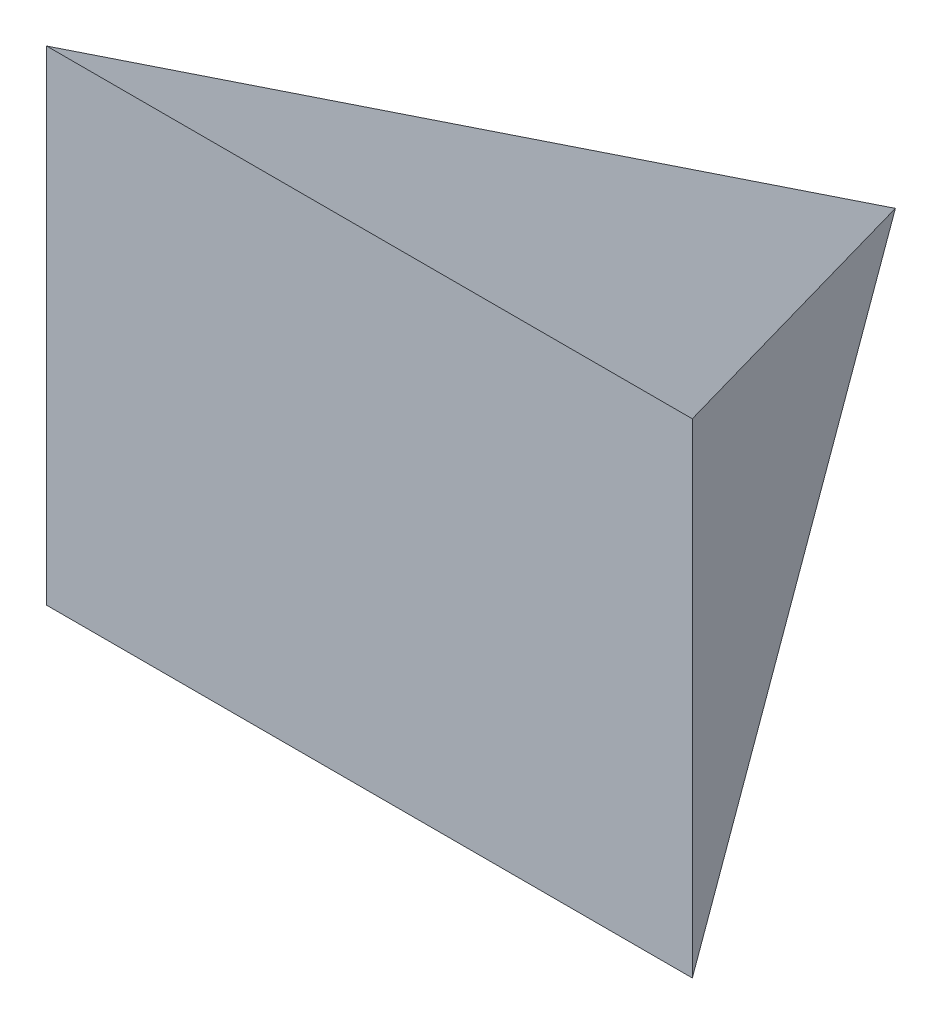
ISO-10303-21;
HEADER;
FILE_DESCRIPTION(('STEP AP214'),'2;1');
FILE_NAME('part.step','',(''),(''),'','','');
FILE_SCHEMA(('AUTOMOTIVE_DESIGN { 1 0 10303 214 1 1 1 1 }'));
ENDSEC;
DATA;
#1=APPLICATION_CONTEXT('core data for automotive mechanical design processes');
#2=APPLICATION_PROTOCOL_DEFINITION('international standard','automotive_design',2000,#1);
#3=PRODUCT_CONTEXT('',#1,'mechanical');
#4=PRODUCT('Part','Part','',(#3));
#5=PRODUCT_RELATED_PRODUCT_CATEGORY('part','',(#4));
#6=PRODUCT_DEFINITION_FORMATION('','',#4);
#7=PRODUCT_DEFINITION_CONTEXT('part definition',#1,'design');
#8=PRODUCT_DEFINITION('design','',#6,#7);
#9=PRODUCT_DEFINITION_SHAPE('','',#8);
#10=(LENGTH_UNIT() NAMED_UNIT(*) SI_UNIT(.MILLI.,.METRE.));
#11=(NAMED_UNIT(*) PLANE_ANGLE_UNIT() SI_UNIT($,.RADIAN.));
#12=(NAMED_UNIT(*) SI_UNIT($,.STERADIAN.) SOLID_ANGLE_UNIT());
#13=UNCERTAINTY_MEASURE_WITH_UNIT(LENGTH_MEASURE(1.E-05),#10,'distance_accuracy_value','');
#14=(GEOMETRIC_REPRESENTATION_CONTEXT(3) GLOBAL_UNCERTAINTY_ASSIGNED_CONTEXT((#13)) GLOBAL_UNIT_ASSIGNED_CONTEXT((#10,
#11,#12)) REPRESENTATION_CONTEXT('',''));
#15=CARTESIAN_POINT('',(0.,0.,0.));
#16=DIRECTION('',(0.,0.,1.));
#17=DIRECTION('',(1.,0.,0.));
#18=AXIS2_PLACEMENT_3D('',#15,#16,#17);
#19=CARTESIAN_POINT('',(0.,0.,0.));
#20=DIRECTION('',(0.,0.,-1.));
#21=DIRECTION('',(-1.,0.,0.));
#22=AXIS2_PLACEMENT_3D('',#19,#20,#21);
#23=PLANE('',#22);
#24=DIRECTION('',(0.,-1.,0.));
#25=VECTOR('',#24,1.);
#26=CARTESIAN_POINT('',(0.,87.392658036248,0.));
#27=LINE('',#26,#25);
#28=CARTESIAN_POINT('',(0.,387.392658036248,0.));
#29=VERTEX_POINT('',#28);
#30=CARTESIAN_POINT('',(0.,87.392658036248,0.));
#31=VERTEX_POINT('',#30);
#32=EDGE_CURVE('E71',#29,#31,#27,.T.);
#33=ORIENTED_EDGE('',*,*,#32,.T.);
#34=DIRECTION('',(1.,0.,0.));
#35=VECTOR('',#34,1.);
#36=CARTESIAN_POINT('',(0.,87.392658036248,0.));
#37=LINE('',#36,#35);
#38=CARTESIAN_POINT('',(400.,87.392658036248,0.));
#39=VERTEX_POINT('',#38);
#40=EDGE_CURVE('E47',#31,#39,#37,.T.);
#41=ORIENTED_EDGE('',*,*,#40,.T.);
#42=DIRECTION('',(0.,1.,0.));
#43=VECTOR('',#42,1.);
#44=CARTESIAN_POINT('',(400.,87.392658036248,0.));
#45=LINE('',#44,#43);
#46=CARTESIAN_POINT('',(400.,387.392658036248,0.));
#47=VERTEX_POINT('',#46);
#48=EDGE_CURVE('E40',#39,#47,#45,.T.);
#49=ORIENTED_EDGE('',*,*,#48,.T.);
#50=DIRECTION('',(-1.,0.,0.));
#51=VECTOR('',#50,1.);
#52=CARTESIAN_POINT('',(0.,387.392658036248,0.));
#53=LINE('',#52,#51);
#54=EDGE_CURVE('E11',#47,#29,#53,.T.);
#55=ORIENTED_EDGE('',*,*,#54,.T.);
#56=EDGE_LOOP('',(#33,#41,#49,#55));
#57=FACE_BOUND('',#56,.T.);
#58=ADVANCED_FACE('F33',(#57),#23,.F.);
#59=CARTESIAN_POINT('',(200.,87.392658036248,-325.81));
#60=DIRECTION('',(-0.852239769479527,0.,0.523151388526765));
#61=DIRECTION('',(0.523151388526765,0.,0.852239769479527));
#62=AXIS2_PLACEMENT_3D('',#59,#60,#61);
#63=PLANE('',#62);
#64=DIRECTION('',(-0.487005702808802,0.365254277106601,-0.793356640160678));
#65=VECTOR('',#64,1.);
#66=CARTESIAN_POINT('',(226.682137388933,217.381054994548,-282.343464086558));
#67=LINE('',#66,#65);
#68=CARTESIAN_POINT('',(200.,237.392658036248,-325.81));
#69=VERTEX_POINT('',#68);
#70=EDGE_CURVE('E67',#39,#69,#67,.T.);
#71=ORIENTED_EDGE('',*,*,#70,.T.);
#72=DIRECTION('',(0.487005702808802,0.365254277106601,0.793356640160678));
#73=VECTOR('',#72,1.);
#74=CARTESIAN_POINT('',(173.317862611067,217.381054994548,-369.276535913441));
#75=LINE('',#74,#73);
#76=EDGE_CURVE('E64',#69,#47,#75,.T.);
#77=ORIENTED_EDGE('',*,*,#76,.T.);
#78=ORIENTED_EDGE('',*,*,#48,.F.);
#79=EDGE_LOOP('',(#71,#77,#78));
#80=FACE_BOUND('',#79,.T.);
#81=ADVANCED_FACE('F83',(#80),#63,.F.);
#82=CARTESIAN_POINT('',(0.,87.392658036248,0.));
#83=DIRECTION('',(0.852239769479527,0.,0.523151388526765));
#84=DIRECTION('',(0.523151388526765,0.,-0.852239769479527));
#85=AXIS2_PLACEMENT_3D('',#82,#83,#84);
#86=PLANE('',#85);
#87=ORIENTED_EDGE('',*,*,#32,.F.);
#88=DIRECTION('',(-0.487005702808802,0.365254277106601,0.793356640160678));
#89=VECTOR('',#88,1.);
#90=CARTESIAN_POINT('',(0.,387.392658036248,0.));
#91=LINE('',#90,#89);
#92=EDGE_CURVE('E61',#69,#29,#91,.T.);
#93=ORIENTED_EDGE('',*,*,#92,.F.);
#94=DIRECTION('',(0.487005702808802,0.365254277106601,-0.793356640160678));
#95=VECTOR('',#94,1.);
#96=CARTESIAN_POINT('',(200.,237.392658036248,-325.81));
#97=LINE('',#96,#95);
#98=EDGE_CURVE('E68',#31,#69,#97,.T.);
#99=ORIENTED_EDGE('',*,*,#98,.F.);
#100=EDGE_LOOP('',(#87,#93,#99));
#101=FACE_BOUND('',#100,.T.);
#102=ADVANCED_FACE('F72',(#101),#86,.F.);
#103=CARTESIAN_POINT('',(600.,237.392658036248,-325.81));
#104=DIRECTION('',(0.,0.908355552737145,0.418198744392658));
#105=DIRECTION('',(0.,-0.418198744392658,0.908355552737145));
#106=AXIS2_PLACEMENT_3D('',#103,#104,#105);
#107=PLANE('',#106);
#108=ORIENTED_EDGE('',*,*,#40,.F.);
#109=ORIENTED_EDGE('',*,*,#98,.T.);
#110=ORIENTED_EDGE('',*,*,#70,.F.);
#111=EDGE_LOOP('',(#108,#109,#110));
#112=FACE_BOUND('',#111,.T.);
#113=ADVANCED_FACE('F82',(#112),#107,.F.);
#114=CARTESIAN_POINT('',(400.,387.392658036248,0.));
#115=DIRECTION('',(0.,-0.908355552737145,0.418198744392658));
#116=DIRECTION('',(0.,-0.418198744392658,-0.908355552737145));
#117=AXIS2_PLACEMENT_3D('',#114,#115,#116);
#118=PLANE('',#117);
#119=ORIENTED_EDGE('',*,*,#92,.T.);
#120=ORIENTED_EDGE('',*,*,#54,.F.);
#121=ORIENTED_EDGE('',*,*,#76,.F.);
#122=EDGE_LOOP('',(#119,#120,#121));
#123=FACE_BOUND('',#122,.T.);
#124=ADVANCED_FACE('F63',(#123),#118,.F.);
#125=CLOSED_SHELL('',(#58,#81,#102,#113,#124));
#126=MANIFOLD_SOLID_BREP('B2',#125);
#127=ADVANCED_BREP_SHAPE_REPRESENTATION('',(#18,#126),#14);
#128=SHAPE_DEFINITION_REPRESENTATION(#9,#127);
ENDSEC;
END-ISO-10303-21;
